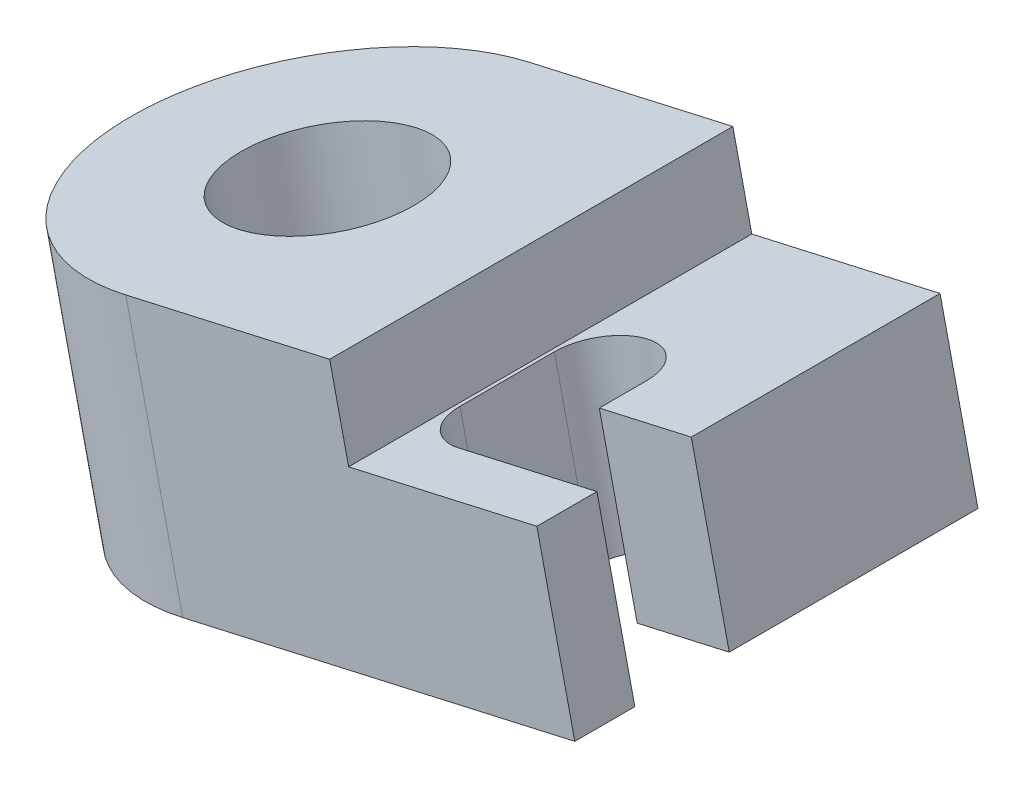
ISO-10303-21;
HEADER;
FILE_DESCRIPTION(('STEP AP214'),'2;1');
FILE_NAME('part.step','',(''),(''),'','','');
FILE_SCHEMA(('AUTOMOTIVE_DESIGN { 1 0 10303 214 1 1 1 1 }'));
ENDSEC;
DATA;
#1=APPLICATION_CONTEXT('core data for automotive mechanical design processes');
#2=APPLICATION_PROTOCOL_DEFINITION('international standard','automotive_design',2000,#1);
#3=PRODUCT_CONTEXT('',#1,'mechanical');
#4=PRODUCT('Part','Part','',(#3));
#5=PRODUCT_RELATED_PRODUCT_CATEGORY('part','',(#4));
#6=PRODUCT_DEFINITION_FORMATION('','',#4);
#7=PRODUCT_DEFINITION_CONTEXT('part definition',#1,'design');
#8=PRODUCT_DEFINITION('design','',#6,#7);
#9=PRODUCT_DEFINITION_SHAPE('','',#8);
#10=(LENGTH_UNIT() NAMED_UNIT(*) SI_UNIT(.MILLI.,.METRE.));
#11=(NAMED_UNIT(*) PLANE_ANGLE_UNIT() SI_UNIT($,.RADIAN.));
#12=(NAMED_UNIT(*) SI_UNIT($,.STERADIAN.) SOLID_ANGLE_UNIT());
#13=UNCERTAINTY_MEASURE_WITH_UNIT(LENGTH_MEASURE(1.E-05),#10,'distance_accuracy_value','');
#14=(GEOMETRIC_REPRESENTATION_CONTEXT(3) GLOBAL_UNCERTAINTY_ASSIGNED_CONTEXT((#13)) GLOBAL_UNIT_ASSIGNED_CONTEXT((#10,
#11,#12)) REPRESENTATION_CONTEXT('',''));
#15=CARTESIAN_POINT('',(0.,0.,0.));
#16=DIRECTION('',(0.,0.,1.));
#17=DIRECTION('',(1.,0.,0.));
#18=AXIS2_PLACEMENT_3D('',#15,#16,#17);
#19=CARTESIAN_POINT('',(-4.53258882757251,1.69501232098695,-1.175));
#20=DIRECTION('',(-0.975257334087785,-0.221072685576457,0.));
#21=DIRECTION('',(0.221072685576457,-0.975257334087785,0.));
#22=AXIS2_PLACEMENT_3D('',#19,#20,#21);
#23=PLANE('',#22);
#24=DIRECTION('',(-0.221072685576457,0.975257334087785,0.));
#25=VECTOR('',#24,1.);
#26=CARTESIAN_POINT('',(-4.03303331511066,-0.508765934305042,0.275000000000011));
#27=LINE('',#26,#25);
#28=CARTESIAN_POINT('',(-4.20097979920783,0.232126319855275,0.275000000000011));
#29=VERTEX_POINT('',#28);
#30=CARTESIAN_POINT('',(-4.42205248478428,1.20738365394306,0.275000000000011));
#31=VERTEX_POINT('',#30);
#32=EDGE_CURVE('E149',#29,#31,#27,.T.);
#33=ORIENTED_EDGE('',*,*,#32,.F.);
#34=DIRECTION('',(0.,0.,-1.));
#35=VECTOR('',#34,1.);
#36=CARTESIAN_POINT('',(-4.20097979920783,0.232126319855275,-1.175));
#37=LINE('',#36,#35);
#38=CARTESIAN_POINT('',(-4.20097979920783,0.232126319855275,-1.175));
#39=VERTEX_POINT('',#38);
#40=EDGE_CURVE('E184',#29,#39,#37,.T.);
#41=ORIENTED_EDGE('',*,*,#40,.T.);
#42=DIRECTION('',(0.221072685576457,-0.975257334087785,0.));
#43=VECTOR('',#42,1.);
#44=CARTESIAN_POINT('',(-4.53258882757251,1.69501232098695,-1.175));
#45=LINE('',#44,#43);
#46=CARTESIAN_POINT('',(-4.42205248478428,1.20738365394306,-1.175));
#47=VERTEX_POINT('',#46);
#48=EDGE_CURVE('E189',#47,#39,#45,.T.);
#49=ORIENTED_EDGE('',*,*,#48,.F.);
#50=DIRECTION('',(0.,0.,-1.));
#51=VECTOR('',#50,1.);
#52=CARTESIAN_POINT('',(-4.42205248478428,1.20738365394306,4.));
#53=LINE('',#52,#51);
#54=EDGE_CURVE('E157',#31,#47,#53,.T.);
#55=ORIENTED_EDGE('',*,*,#54,.F.);
#56=EDGE_LOOP('',(#33,#41,#49,#55));
#57=FACE_BOUND('',#56,.T.);
#58=ADVANCED_FACE('F33',(#57),#23,.F.);
#59=CARTESIAN_POINT('',(-6.4860174688491,-0.285849189391698,0.));
#60=DIRECTION('',(0.221072685576457,-0.975257334087785,0.));
#61=DIRECTION('',(0.975257334087785,0.221072685576457,0.));
#62=AXIS2_PLACEMENT_3D('',#59,#60,#61);
#63=PLANE('',#62);
#64=CARTESIAN_POINT('',(-6.4860174688491,-0.285849189391698,0.));
#65=DIRECTION('',(0.221072685576457,-0.975257334087785,0.));
#66=DIRECTION('',(0.975257334087785,0.221072685576457,0.));
#67=AXIS2_PLACEMENT_3D('',#64,#65,#66);
#68=CIRCLE('',#67,0.515);
#69=CARTESIAN_POINT('',(-5.98375994179389,-0.171996756319822,0.));
#70=VERTEX_POINT('',#69);
#71=EDGE_CURVE('E242',#70,#70,#68,.F.);
#72=ORIENTED_EDGE('',*,*,#71,.T.);
#73=EDGE_LOOP('',(#72));
#74=FACE_BOUND('',#73,.T.);
#75=ORIENTED_EDGE('',*,*,#40,.F.);
#76=DIRECTION('',(0.975257334087785,0.221072685576457,0.));
#77=VECTOR('',#76,1.);
#78=CARTESIAN_POINT('',(-0.255362116309231,1.12652441041897,0.275000000000011));
#79=LINE('',#78,#77);
#80=CARTESIAN_POINT('',(-4.7373713329561,0.110536342788224,0.275000000000011));
#81=VERTEX_POINT('',#80);
#82=EDGE_CURVE('E227',#81,#29,#79,.T.);
#83=ORIENTED_EDGE('',*,*,#82,.F.);
#84=DIRECTION('',(0.,0.,1.));
#85=VECTOR('',#84,1.);
#86=CARTESIAN_POINT('',(-4.7373713329561,0.110536342788224,0.));
#87=LINE('',#86,#85);
#88=CARTESIAN_POINT('',(-4.7373713329561,0.110536342788224,0.));
#89=VERTEX_POINT('',#88);
#90=EDGE_CURVE('E225',#89,#81,#87,.T.);
#91=ORIENTED_EDGE('',*,*,#90,.F.);
#92=CARTESIAN_POINT('',(-5.00556709983026,0.0497413542546963,0.));
#93=DIRECTION('',(0.221072685576457,-0.975257334087785,0.));
#94=DIRECTION('',(0.975257334087785,0.221072685576457,0.));
#95=AXIS2_PLACEMENT_3D('',#92,#93,#94);
#96=CIRCLE('',#95,0.275000000000011);
#97=CARTESIAN_POINT('',(-5.27376286670441,-0.0110536342788318,0.));
#98=VERTEX_POINT('',#97);
#99=EDGE_CURVE('E217',#89,#98,#96,.F.);
#100=ORIENTED_EDGE('',*,*,#99,.T.);
#101=DIRECTION('',(0.,0.,1.));
#102=VECTOR('',#101,1.);
#103=CARTESIAN_POINT('',(-5.27376286670441,-0.0110536342788318,0.));
#104=LINE('',#103,#102);
#105=CARTESIAN_POINT('',(-5.27376286670441,-0.0110536342788318,0.550000000000023));
#106=VERTEX_POINT('',#105);
#107=EDGE_CURVE('E214',#98,#106,#104,.T.);
#108=ORIENTED_EDGE('',*,*,#107,.T.);
#109=CARTESIAN_POINT('',(-5.00556709983026,0.0497413542546963,0.550000000000023));
#110=DIRECTION('',(0.221072685576457,-0.975257334087785,0.));
#111=DIRECTION('',(0.975257334087785,0.221072685576457,0.));
#112=AXIS2_PLACEMENT_3D('',#109,#110,#111);
#113=CIRCLE('',#112,0.275000000000012);
#114=CARTESIAN_POINT('',(-5.00556709983026,0.0497413542546962,0.825000000000034));
#115=VERTEX_POINT('',#114);
#116=EDGE_CURVE('E162',#106,#115,#113,.F.);
#117=ORIENTED_EDGE('',*,*,#116,.T.);
#118=DIRECTION('',(0.975257334087785,0.221072685576457,0.));
#119=VECTOR('',#118,1.);
#120=CARTESIAN_POINT('',(-0.255362116309231,1.12652441041897,0.825000000000033));
#121=LINE('',#120,#119);
#122=CARTESIAN_POINT('',(-4.20097979920783,0.232126319855275,0.825000000000034));
#123=VERTEX_POINT('',#122);
#124=EDGE_CURVE('E212',#115,#123,#121,.T.);
#125=ORIENTED_EDGE('',*,*,#124,.T.);
#126=CARTESIAN_POINT('',(-4.20097979920783,0.232126319855275,1.175));
#127=VERTEX_POINT('',#126);
#128=EDGE_CURVE('E148',#127,#123,#37,.T.);
#129=ORIENTED_EDGE('',*,*,#128,.F.);
#130=DIRECTION('',(0.975257334087785,0.221072685576457,0.));
#131=VECTOR('',#130,1.);
#132=CARTESIAN_POINT('',(-4.20097979920783,0.232126319855275,1.175));
#133=LINE('',#132,#131);
#134=CARTESIAN_POINT('',(-6.4860174688491,-0.285849189391698,1.175));
#135=VERTEX_POINT('',#134);
#136=EDGE_CURVE('E182',#135,#127,#133,.T.);
#137=ORIENTED_EDGE('',*,*,#136,.F.);
#138=CARTESIAN_POINT('',(-6.4860174688491,-0.285849189391698,0.));
#139=DIRECTION('',(-0.221072685576457,0.975257334087785,0.));
#140=DIRECTION('',(0.975257334087785,0.221072685576457,0.));
#141=AXIS2_PLACEMENT_3D('',#138,#139,#140);
#142=CIRCLE('',#141,1.175);
#143=CARTESIAN_POINT('',(-6.4860174688491,-0.285849189391698,-1.175));
#144=VERTEX_POINT('',#143);
#145=EDGE_CURVE('E169',#144,#135,#142,.T.);
#146=ORIENTED_EDGE('',*,*,#145,.F.);
#147=DIRECTION('',(-0.975257334087785,-0.221072685576457,0.));
#148=VECTOR('',#147,1.);
#149=CARTESIAN_POINT('',(-6.4860174688491,-0.285849189391698,-1.175));
#150=LINE('',#149,#148);
#151=EDGE_CURVE('E174',#39,#144,#150,.T.);
#152=ORIENTED_EDGE('',*,*,#151,.F.);
#153=EDGE_LOOP('',(#75,#83,#91,#100,#108,#117,#125,#129,#137,#146,#152));
#154=FACE_BOUND('',#153,.T.);
#155=ADVANCED_FACE('F210',(#74,#154),#63,.T.);
#156=CARTESIAN_POINT('',(-0.476434801885693,2.10178174450676,4.));
#157=DIRECTION('',(-0.221072685576458,0.975257334087784,0.));
#158=DIRECTION('',(-0.975257334087784,-0.221072685576458,0.));
#159=AXIS2_PLACEMENT_3D('',#156,#157,#158);
#160=PLANE('',#159);
#161=DIRECTION('',(0.,0.,-1.));
#162=VECTOR('',#161,1.);
#163=CARTESIAN_POINT('',(-4.95844401853256,1.08579367687601,0.));
#164=LINE('',#163,#162);
#165=CARTESIAN_POINT('',(-4.95844401853256,1.08579367687601,0.275000000000011));
#166=VERTEX_POINT('',#165);
#167=CARTESIAN_POINT('',(-4.95844401853256,1.08579367687601,0.));
#168=VERTEX_POINT('',#167);
#169=EDGE_CURVE('E219',#166,#168,#164,.T.);
#170=ORIENTED_EDGE('',*,*,#169,.F.);
#171=DIRECTION('',(-0.975257334087784,-0.221072685576458,0.));
#172=VECTOR('',#171,1.);
#173=CARTESIAN_POINT('',(-0.476434801885692,2.10178174450676,0.275000000000011));
#174=LINE('',#173,#172);
#175=EDGE_CURVE('E215',#31,#166,#174,.T.);
#176=ORIENTED_EDGE('',*,*,#175,.F.);
#177=ORIENTED_EDGE('',*,*,#54,.T.);
#178=DIRECTION('',(-0.975257334087785,-0.221072685576458,0.));
#179=VECTOR('',#178,1.);
#180=CARTESIAN_POINT('',(-6.70709015442556,0.689408144696087,-1.175));
#181=LINE('',#180,#179);
#182=CARTESIAN_POINT('',(-5.51921698563304,0.958676882669548,-1.175));
#183=VERTEX_POINT('',#182);
#184=EDGE_CURVE('E11',#47,#183,#181,.T.);
#185=ORIENTED_EDGE('',*,*,#184,.T.);
#186=DIRECTION('',(0.,0.,-1.));
#187=VECTOR('',#186,1.);
#188=CARTESIAN_POINT('',(-5.51921698563304,0.958676882669548,4.));
#189=LINE('',#188,#187);
#190=CARTESIAN_POINT('',(-5.51921698563304,0.958676882669548,1.175));
#191=VERTEX_POINT('',#190);
#192=EDGE_CURVE('E156',#191,#183,#189,.T.);
#193=ORIENTED_EDGE('',*,*,#192,.F.);
#194=DIRECTION('',(0.975257334087785,0.221072685576458,0.));
#195=VECTOR('',#194,1.);
#196=CARTESIAN_POINT('',(-4.42205248478428,1.20738365394306,1.175));
#197=LINE('',#196,#195);
#198=CARTESIAN_POINT('',(-4.42205248478428,1.20738365394306,1.175));
#199=VERTEX_POINT('',#198);
#200=EDGE_CURVE('E155',#191,#199,#197,.T.);
#201=ORIENTED_EDGE('',*,*,#200,.T.);
#202=CARTESIAN_POINT('',(-4.42205248478428,1.20738365394306,0.825000000000034));
#203=VERTEX_POINT('',#202);
#204=EDGE_CURVE('E145',#199,#203,#53,.T.);
#205=ORIENTED_EDGE('',*,*,#204,.T.);
#206=DIRECTION('',(-0.975257334087784,-0.221072685576458,0.));
#207=VECTOR('',#206,1.);
#208=CARTESIAN_POINT('',(-0.476434801885692,2.10178174450676,0.825000000000033));
#209=LINE('',#208,#207);
#210=CARTESIAN_POINT('',(-5.22663978540671,1.02499868834248,0.825000000000034));
#211=VERTEX_POINT('',#210);
#212=EDGE_CURVE('E128',#203,#211,#209,.T.);
#213=ORIENTED_EDGE('',*,*,#212,.T.);
#214=CARTESIAN_POINT('',(-5.22663978540671,1.02499868834248,0.550000000000023));
#215=DIRECTION('',(-0.221072685576458,0.975257334087784,0.));
#216=DIRECTION('',(-0.975257334087784,-0.221072685576458,0.));
#217=AXIS2_PLACEMENT_3D('',#214,#215,#216);
#218=CIRCLE('',#217,0.275000000000012);
#219=CARTESIAN_POINT('',(-5.49483555228086,0.964203699808955,0.550000000000023));
#220=VERTEX_POINT('',#219);
#221=EDGE_CURVE('E232',#211,#220,#218,.F.);
#222=ORIENTED_EDGE('',*,*,#221,.T.);
#223=DIRECTION('',(0.,0.,-1.));
#224=VECTOR('',#223,1.);
#225=CARTESIAN_POINT('',(-5.49483555228086,0.964203699808955,0.));
#226=LINE('',#225,#224);
#227=CARTESIAN_POINT('',(-5.49483555228086,0.964203699808955,0.));
#228=VERTEX_POINT('',#227);
#229=EDGE_CURVE('E138',#220,#228,#226,.T.);
#230=ORIENTED_EDGE('',*,*,#229,.T.);
#231=CARTESIAN_POINT('',(-5.22663978540671,1.02499868834248,0.));
#232=DIRECTION('',(-0.221072685576458,0.975257334087784,0.));
#233=DIRECTION('',(-0.975257334087784,-0.221072685576458,0.));
#234=AXIS2_PLACEMENT_3D('',#231,#232,#233);
#235=CIRCLE('',#234,0.275000000000011);
#236=EDGE_CURVE('E251',#228,#168,#235,.F.);
#237=ORIENTED_EDGE('',*,*,#236,.T.);
#238=EDGE_LOOP('',(#170,#176,#177,#185,#193,#201,#205,#213,#222,#230,#237));
#239=FACE_BOUND('',#238,.T.);
#240=ADVANCED_FACE('F152',(#239),#160,.T.);
#241=CARTESIAN_POINT('',(-4.53258882757251,1.69501232098695,1.175));
#242=DIRECTION('',(0.,0.,-1.));
#243=DIRECTION('',(-1.,0.,0.));
#244=AXIS2_PLACEMENT_3D('',#241,#242,#243);
#245=PLANE('',#244);
#246=DIRECTION('',(0.221072685576459,-0.975257334087784,0.));
#247=VECTOR('',#246,1.);
#248=CARTESIAN_POINT('',(-5.62975332842127,1.44630554971344,1.175));
#249=LINE('',#248,#247);
#250=CARTESIAN_POINT('',(-5.62975332842127,1.44630554971344,1.175));
#251=VERTEX_POINT('',#250);
#252=EDGE_CURVE('E166',#251,#191,#249,.T.);
#253=ORIENTED_EDGE('',*,*,#252,.F.);
#254=DIRECTION('',(0.975257334087785,0.221072685576457,0.));
#255=VECTOR('',#254,1.);
#256=CARTESIAN_POINT('',(-4.53258882757251,1.69501232098695,1.175));
#257=LINE('',#256,#255);
#258=CARTESIAN_POINT('',(-6.81762649721379,1.17703681173998,1.175));
#259=VERTEX_POINT('',#258);
#260=EDGE_CURVE('E173',#259,#251,#257,.T.);
#261=ORIENTED_EDGE('',*,*,#260,.F.);
#262=DIRECTION('',(0.221072685576457,-0.975257334087785,0.));
#263=VECTOR('',#262,1.);
#264=CARTESIAN_POINT('',(-6.81762649721379,1.17703681173998,1.175));
#265=LINE('',#264,#263);
#266=EDGE_CURVE('E194',#259,#135,#265,.T.);
#267=ORIENTED_EDGE('',*,*,#266,.T.);
#268=ORIENTED_EDGE('',*,*,#136,.T.);
#269=DIRECTION('',(0.221072685576457,-0.975257334087785,0.));
#270=VECTOR('',#269,1.);
#271=CARTESIAN_POINT('',(-4.53258882757251,1.69501232098695,1.175));
#272=LINE('',#271,#270);
#273=EDGE_CURVE('E192',#199,#127,#272,.T.);
#274=ORIENTED_EDGE('',*,*,#273,.F.);
#275=ORIENTED_EDGE('',*,*,#200,.F.);
#276=EDGE_LOOP('',(#253,#261,#267,#268,#274,#275));
#277=FACE_BOUND('',#276,.T.);
#278=ADVANCED_FACE('F201',(#277),#245,.F.);
#279=ORIENTED_EDGE('',*,*,#128,.T.);
#280=DIRECTION('',(-0.221072685576457,0.975257334087785,0.));
#281=VECTOR('',#280,1.);
#282=CARTESIAN_POINT('',(-4.03303331511066,-0.508765934305042,0.825000000000034));
#283=LINE('',#282,#281);
#284=EDGE_CURVE('E131',#123,#203,#283,.T.);
#285=ORIENTED_EDGE('',*,*,#284,.T.);
#286=ORIENTED_EDGE('',*,*,#204,.F.);
#287=ORIENTED_EDGE('',*,*,#273,.T.);
#288=EDGE_LOOP('',(#279,#285,#286,#287));
#289=FACE_BOUND('',#288,.T.);
#290=ADVANCED_FACE('F143',(#289),#23,.F.);
#291=CARTESIAN_POINT('',(-6.81762649721379,1.17703681173998,-1.175));
#292=DIRECTION('',(0.,0.,1.));
#293=DIRECTION('',(1.,0.,0.));
#294=AXIS2_PLACEMENT_3D('',#291,#292,#293);
#295=PLANE('',#294);
#296=DIRECTION('',(-0.221072685576459,0.975257334087784,0.));
#297=VECTOR('',#296,1.);
#298=CARTESIAN_POINT('',(-5.62975332842127,1.44630554971344,-1.175));
#299=LINE('',#298,#297);
#300=CARTESIAN_POINT('',(-5.62975332842127,1.44630554971344,-1.175));
#301=VERTEX_POINT('',#300);
#302=EDGE_CURVE('E56',#183,#301,#299,.T.);
#303=ORIENTED_EDGE('',*,*,#302,.F.);
#304=ORIENTED_EDGE('',*,*,#184,.F.);
#305=ORIENTED_EDGE('',*,*,#48,.T.);
#306=ORIENTED_EDGE('',*,*,#151,.T.);
#307=DIRECTION('',(0.221072685576457,-0.975257334087785,0.));
#308=VECTOR('',#307,1.);
#309=CARTESIAN_POINT('',(-6.81762649721379,1.17703681173998,-1.175));
#310=LINE('',#309,#308);
#311=CARTESIAN_POINT('',(-6.81762649721379,1.17703681173998,-1.175));
#312=VERTEX_POINT('',#311);
#313=EDGE_CURVE('E179',#312,#144,#310,.T.);
#314=ORIENTED_EDGE('',*,*,#313,.F.);
#315=DIRECTION('',(-0.975257334087785,-0.221072685576457,0.));
#316=VECTOR('',#315,1.);
#317=CARTESIAN_POINT('',(-6.81762649721379,1.17703681173998,-1.175));
#318=LINE('',#317,#316);
#319=EDGE_CURVE('E177',#301,#312,#318,.T.);
#320=ORIENTED_EDGE('',*,*,#319,.F.);
#321=EDGE_LOOP('',(#303,#304,#305,#306,#314,#320));
#322=FACE_BOUND('',#321,.T.);
#323=ADVANCED_FACE('F274',(#322),#295,.F.);
#324=CARTESIAN_POINT('',(-6.81762649721379,1.17703681173998,0.));
#325=DIRECTION('',(0.221072685576457,-0.975257334087785,0.));
#326=DIRECTION('',(0.975257334087785,0.221072685576457,0.));
#327=AXIS2_PLACEMENT_3D('',#324,#325,#326);
#328=PLANE('',#327);
#329=CARTESIAN_POINT('',(-6.81762649721379,1.17703681173998,0.));
#330=DIRECTION('',(-0.221072685576457,0.975257334087785,0.));
#331=DIRECTION('',(-0.975257334087785,-0.221072685576457,0.));
#332=AXIS2_PLACEMENT_3D('',#329,#330,#331);
#333=CIRCLE('',#332,0.515);
#334=CARTESIAN_POINT('',(-7.31988402426899,1.06318437866811,0.));
#335=VERTEX_POINT('',#334);
#336=EDGE_CURVE('E160',#335,#335,#333,.T.);
#337=ORIENTED_EDGE('',*,*,#336,.F.);
#338=EDGE_LOOP('',(#337));
#339=FACE_BOUND('',#338,.T.);
#340=DIRECTION('',(0.,0.,1.));
#341=VECTOR('',#340,1.);
#342=CARTESIAN_POINT('',(-5.62975332842127,1.44630554971344,0.));
#343=LINE('',#342,#341);
#344=EDGE_CURVE('E41',#301,#251,#343,.T.);
#345=ORIENTED_EDGE('',*,*,#344,.F.);
#346=ORIENTED_EDGE('',*,*,#319,.T.);
#347=CARTESIAN_POINT('',(-6.81762649721379,1.17703681173998,0.));
#348=DIRECTION('',(-0.221072685576457,0.975257334087785,0.));
#349=DIRECTION('',(0.975257334087785,0.221072685576457,0.));
#350=AXIS2_PLACEMENT_3D('',#347,#348,#349);
#351=CIRCLE('',#350,1.175);
#352=EDGE_CURVE('E170',#312,#259,#351,.T.);
#353=ORIENTED_EDGE('',*,*,#352,.T.);
#354=ORIENTED_EDGE('',*,*,#260,.T.);
#355=EDGE_LOOP('',(#345,#346,#353,#354));
#356=FACE_BOUND('',#355,.T.);
#357=ADVANCED_FACE('F202',(#339,#356),#328,.F.);
#358=CARTESIAN_POINT('',(-6.81762649721379,1.17703681173998,0.));
#359=DIRECTION('',(0.221072685576457,-0.975257334087785,0.));
#360=DIRECTION('',(0.975257334087785,0.221072685576457,0.));
#361=AXIS2_PLACEMENT_3D('',#358,#359,#360);
#362=CYLINDRICAL_SURFACE('',#361,1.175);
#363=ORIENTED_EDGE('',*,*,#145,.T.);
#364=ORIENTED_EDGE('',*,*,#266,.F.);
#365=ORIENTED_EDGE('',*,*,#352,.F.);
#366=ORIENTED_EDGE('',*,*,#313,.T.);
#367=EDGE_LOOP('',(#363,#364,#365,#366));
#368=FACE_BOUND('',#367,.T.);
#369=ADVANCED_FACE('F35',(#368),#362,.T.);
#370=CARTESIAN_POINT('',(-5.04278218374735,-1.14310486183721,4.));
#371=DIRECTION('',(0.975257334087784,0.221072685576459,0.));
#372=DIRECTION('',(-0.221072685576459,0.975257334087784,0.));
#373=AXIS2_PLACEMENT_3D('',#370,#371,#372);
#374=PLANE('',#373);
#375=ORIENTED_EDGE('',*,*,#252,.T.);
#376=ORIENTED_EDGE('',*,*,#192,.T.);
#377=ORIENTED_EDGE('',*,*,#302,.T.);
#378=ORIENTED_EDGE('',*,*,#344,.T.);
#379=EDGE_LOOP('',(#375,#376,#377,#378));
#380=FACE_BOUND('',#379,.T.);
#381=ADVANCED_FACE('F197',(#380),#374,.T.);
#382=CARTESIAN_POINT('',(-5.10581638260724,-0.751945888439148,0.));
#383=DIRECTION('',(-0.975257334087785,-0.221072685576457,0.));
#384=DIRECTION('',(0.221072685576457,-0.975257334087785,0.));
#385=AXIS2_PLACEMENT_3D('',#382,#383,#384);
#386=PLANE('',#385);
#387=DIRECTION('',(-0.221072685576457,0.975257334087785,0.));
#388=VECTOR('',#387,1.);
#389=CARTESIAN_POINT('',(-5.10581638260724,-0.751945888439148,0.));
#390=LINE('',#389,#388);
#391=EDGE_CURVE('E229',#98,#228,#390,.T.);
#392=ORIENTED_EDGE('',*,*,#391,.T.);
#393=ORIENTED_EDGE('',*,*,#229,.F.);
#394=DIRECTION('',(-0.221072685576457,0.975257334087785,0.));
#395=VECTOR('',#394,1.);
#396=CARTESIAN_POINT('',(-5.10581638260724,-0.751945888439148,0.550000000000023));
#397=LINE('',#396,#395);
#398=EDGE_CURVE('E48',#106,#220,#397,.T.);
#399=ORIENTED_EDGE('',*,*,#398,.F.);
#400=ORIENTED_EDGE('',*,*,#107,.F.);
#401=EDGE_LOOP('',(#392,#393,#399,#400));
#402=FACE_BOUND('',#401,.T.);
#403=ADVANCED_FACE('F263',(#402),#386,.F.);
#404=CARTESIAN_POINT('',(-4.83762061573309,-0.691150899905621,0.));
#405=DIRECTION('',(-0.221072685576457,0.975257334087785,0.));
#406=DIRECTION('',(-0.975257334087785,-0.221072685576457,0.));
#407=AXIS2_PLACEMENT_3D('',#404,#405,#406);
#408=CYLINDRICAL_SURFACE('',#407,0.275000000000011);
#409=DIRECTION('',(-0.221072685576457,0.975257334087785,0.));
#410=VECTOR('',#409,1.);
#411=CARTESIAN_POINT('',(-4.56942484885894,-0.630355911372093,0.));
#412=LINE('',#411,#410);
#413=EDGE_CURVE('E233',#89,#168,#412,.T.);
#414=ORIENTED_EDGE('',*,*,#413,.T.);
#415=ORIENTED_EDGE('',*,*,#236,.F.);
#416=ORIENTED_EDGE('',*,*,#391,.F.);
#417=ORIENTED_EDGE('',*,*,#99,.F.);
#418=EDGE_LOOP('',(#414,#415,#416,#417));
#419=FACE_BOUND('',#418,.T.);
#420=ADVANCED_FACE('F260',(#419),#408,.F.);
#421=CARTESIAN_POINT('',(-4.56942484885894,-0.630355911372093,0.));
#422=DIRECTION('',(-0.975257334087785,-0.221072685576457,0.));
#423=DIRECTION('',(0.221072685576457,-0.975257334087785,0.));
#424=AXIS2_PLACEMENT_3D('',#421,#422,#423);
#425=PLANE('',#424);
#426=ORIENTED_EDGE('',*,*,#90,.T.);
#427=DIRECTION('',(-0.221072685576457,0.975257334087785,0.));
#428=VECTOR('',#427,1.);
#429=CARTESIAN_POINT('',(-4.56942484885894,-0.630355911372092,0.275000000000011));
#430=LINE('',#429,#428);
#431=EDGE_CURVE('E236',#81,#166,#430,.T.);
#432=ORIENTED_EDGE('',*,*,#431,.T.);
#433=ORIENTED_EDGE('',*,*,#169,.T.);
#434=ORIENTED_EDGE('',*,*,#413,.F.);
#435=EDGE_LOOP('',(#426,#432,#433,#434));
#436=FACE_BOUND('',#435,.T.);
#437=ADVANCED_FACE('F255',(#436),#425,.T.);
#438=CARTESIAN_POINT('',(-0.0874156322120671,0.385632156258647,0.275000000000011));
#439=DIRECTION('',(0.,0.,1.));
#440=DIRECTION('',(1.,0.,0.));
#441=AXIS2_PLACEMENT_3D('',#438,#439,#440);
#442=PLANE('',#441);
#443=ORIENTED_EDGE('',*,*,#82,.T.);
#444=ORIENTED_EDGE('',*,*,#32,.T.);
#445=ORIENTED_EDGE('',*,*,#175,.T.);
#446=ORIENTED_EDGE('',*,*,#431,.F.);
#447=EDGE_LOOP('',(#443,#444,#445,#446));
#448=FACE_BOUND('',#447,.T.);
#449=ADVANCED_FACE('F266',(#448),#442,.T.);
#450=CARTESIAN_POINT('',(-0.087415632212067,0.385632156258647,0.825000000000033));
#451=DIRECTION('',(0.,0.,1.));
#452=DIRECTION('',(1.,0.,0.));
#453=AXIS2_PLACEMENT_3D('',#450,#451,#452);
#454=PLANE('',#453);
#455=DIRECTION('',(-0.221072685576457,0.975257334087785,0.));
#456=VECTOR('',#455,1.);
#457=CARTESIAN_POINT('',(-4.83762061573309,-0.69115089990562,0.825000000000034));
#458=LINE('',#457,#456);
#459=EDGE_CURVE('E134',#115,#211,#458,.T.);
#460=ORIENTED_EDGE('',*,*,#459,.T.);
#461=ORIENTED_EDGE('',*,*,#212,.F.);
#462=ORIENTED_EDGE('',*,*,#284,.F.);
#463=ORIENTED_EDGE('',*,*,#124,.F.);
#464=EDGE_LOOP('',(#460,#461,#462,#463));
#465=FACE_BOUND('',#464,.T.);
#466=ADVANCED_FACE('F130',(#465),#454,.F.);
#467=CARTESIAN_POINT('',(-4.83762061573309,-0.691150899905621,0.550000000000023));
#468=DIRECTION('',(-0.221072685576457,0.975257334087785,0.));
#469=DIRECTION('',(-0.975257334087785,-0.221072685576457,0.));
#470=AXIS2_PLACEMENT_3D('',#467,#468,#469);
#471=CYLINDRICAL_SURFACE('',#470,0.275000000000012);
#472=ORIENTED_EDGE('',*,*,#398,.T.);
#473=ORIENTED_EDGE('',*,*,#221,.F.);
#474=ORIENTED_EDGE('',*,*,#459,.F.);
#475=ORIENTED_EDGE('',*,*,#116,.F.);
#476=EDGE_LOOP('',(#472,#473,#474,#475));
#477=FACE_BOUND('',#476,.T.);
#478=ADVANCED_FACE('F380',(#477),#471,.F.);
#479=CARTESIAN_POINT('',(-6.31807098475194,-1.02674144355201,0.));
#480=DIRECTION('',(-0.221072685576457,0.975257334087785,0.));
#481=DIRECTION('',(-0.975257334087785,-0.221072685576457,0.));
#482=AXIS2_PLACEMENT_3D('',#479,#480,#481);
#483=CYLINDRICAL_SURFACE('',#482,0.515);
#484=ORIENTED_EDGE('',*,*,#71,.F.);
#485=EDGE_LOOP('',(#484));
#486=FACE_BOUND('',#485,.T.);
#487=ORIENTED_EDGE('',*,*,#336,.T.);
#488=EDGE_LOOP('',(#487));
#489=FACE_BOUND('',#488,.T.);
#490=ADVANCED_FACE('F388',(#486,#489),#483,.F.);
#491=CLOSED_SHELL('',(#58,#155,#240,#278,#290,#323,#357,#369,#381,#403,#420,#437,#449,#466,#478,#490));
#492=MANIFOLD_SOLID_BREP('B2',#491);
#493=ADVANCED_BREP_SHAPE_REPRESENTATION('',(#18,#492),#14);
#494=SHAPE_DEFINITION_REPRESENTATION(#9,#493);
ENDSEC;
END-ISO-10303-21;
